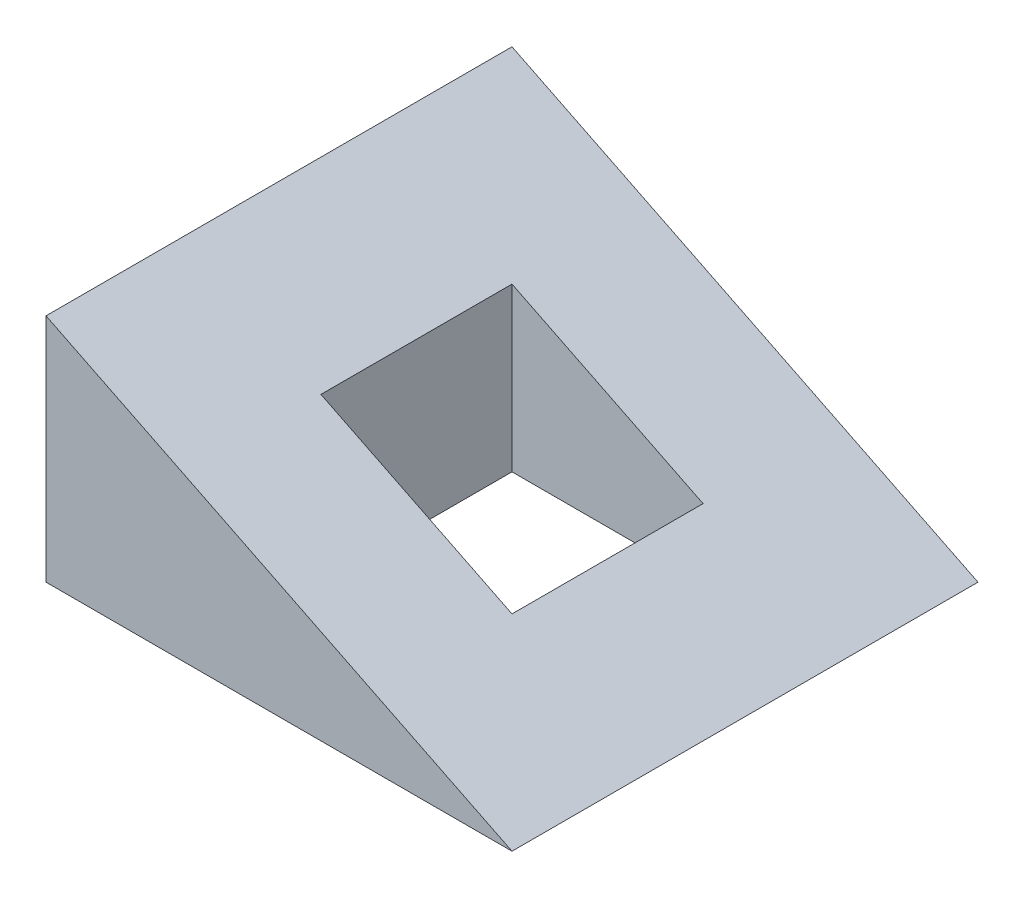
ISO-10303-21;
HEADER;
FILE_DESCRIPTION(('STEP AP214'),'2;1');
FILE_NAME('part.step','',(''),(''),'','','');
FILE_SCHEMA(('AUTOMOTIVE_DESIGN { 1 0 10303 214 1 1 1 1 }'));
ENDSEC;
DATA;
#1=APPLICATION_CONTEXT('core data for automotive mechanical design processes');
#2=APPLICATION_PROTOCOL_DEFINITION('international standard','automotive_design',2000,#1);
#3=PRODUCT_CONTEXT('',#1,'mechanical');
#4=PRODUCT('Part','Part','',(#3));
#5=PRODUCT_RELATED_PRODUCT_CATEGORY('part','',(#4));
#6=PRODUCT_DEFINITION_FORMATION('','',#4);
#7=PRODUCT_DEFINITION_CONTEXT('part definition',#1,'design');
#8=PRODUCT_DEFINITION('design','',#6,#7);
#9=PRODUCT_DEFINITION_SHAPE('','',#8);
#10=(LENGTH_UNIT() NAMED_UNIT(*) SI_UNIT(.MILLI.,.METRE.));
#11=(NAMED_UNIT(*) PLANE_ANGLE_UNIT() SI_UNIT($,.RADIAN.));
#12=(NAMED_UNIT(*) SI_UNIT($,.STERADIAN.) SOLID_ANGLE_UNIT());
#13=UNCERTAINTY_MEASURE_WITH_UNIT(LENGTH_MEASURE(1.E-05),#10,'distance_accuracy_value','');
#14=(GEOMETRIC_REPRESENTATION_CONTEXT(3) GLOBAL_UNCERTAINTY_ASSIGNED_CONTEXT((#13)) GLOBAL_UNIT_ASSIGNED_CONTEXT((#10,
#11,#12)) REPRESENTATION_CONTEXT('',''));
#15=CARTESIAN_POINT('',(0.,0.,0.));
#16=DIRECTION('',(0.,0.,1.));
#17=DIRECTION('',(1.,0.,0.));
#18=AXIS2_PLACEMENT_3D('',#15,#16,#17);
#19=CARTESIAN_POINT('',(0.,9.9,20.));
#20=DIRECTION('',(1.,0.,0.));
#21=DIRECTION('',(0.,0.,-1.));
#22=AXIS2_PLACEMENT_3D('',#19,#20,#21);
#23=PLANE('',#22);
#24=DIRECTION('',(0.,-1.,0.));
#25=VECTOR('',#24,1.);
#26=CARTESIAN_POINT('',(0.,9.9,0.));
#27=LINE('',#26,#25);
#28=CARTESIAN_POINT('',(0.,9.9,0.));
#29=VERTEX_POINT('',#28);
#30=CARTESIAN_POINT('',(0.,0.,0.));
#31=VERTEX_POINT('',#30);
#32=EDGE_CURVE('E122',#29,#31,#27,.T.);
#33=ORIENTED_EDGE('',*,*,#32,.T.);
#34=DIRECTION('',(0.,0.,-1.));
#35=VECTOR('',#34,1.);
#36=CARTESIAN_POINT('',(0.,0.,20.));
#37=LINE('',#36,#35);
#38=CARTESIAN_POINT('',(0.,0.,20.));
#39=VERTEX_POINT('',#38);
#40=EDGE_CURVE('E144',#39,#31,#37,.T.);
#41=ORIENTED_EDGE('',*,*,#40,.F.);
#42=DIRECTION('',(0.,-1.,0.));
#43=VECTOR('',#42,1.);
#44=CARTESIAN_POINT('',(0.,9.9,20.));
#45=LINE('',#44,#43);
#46=CARTESIAN_POINT('',(0.,9.9,20.));
#47=VERTEX_POINT('',#46);
#48=EDGE_CURVE('E125',#47,#39,#45,.T.);
#49=ORIENTED_EDGE('',*,*,#48,.F.);
#50=DIRECTION('',(0.,0.,-1.));
#51=VECTOR('',#50,1.);
#52=CARTESIAN_POINT('',(0.,9.9,20.));
#53=LINE('',#52,#51);
#54=EDGE_CURVE('E133',#47,#29,#53,.T.);
#55=ORIENTED_EDGE('',*,*,#54,.T.);
#56=EDGE_LOOP('',(#33,#41,#49,#55));
#57=FACE_BOUND('',#56,.T.);
#58=ADVANCED_FACE('F38',(#57),#23,.F.);
#59=CARTESIAN_POINT('',(0.,0.,20.));
#60=DIRECTION('',(0.,1.,0.));
#61=DIRECTION('',(0.,0.,1.));
#62=AXIS2_PLACEMENT_3D('',#59,#60,#61);
#63=PLANE('',#62);
#64=DIRECTION('',(-1.,0.,0.));
#65=VECTOR('',#64,1.);
#66=CARTESIAN_POINT('',(5.9,0.,14.1));
#67=LINE('',#66,#65);
#68=CARTESIAN_POINT('',(14.1,0.,14.1));
#69=VERTEX_POINT('',#68);
#70=CARTESIAN_POINT('',(5.9,0.,14.1));
#71=VERTEX_POINT('',#70);
#72=EDGE_CURVE('E108',#69,#71,#67,.T.);
#73=ORIENTED_EDGE('',*,*,#72,.F.);
#74=DIRECTION('',(0.,0.,1.));
#75=VECTOR('',#74,1.);
#76=CARTESIAN_POINT('',(14.1,0.,5.9));
#77=LINE('',#76,#75);
#78=CARTESIAN_POINT('',(14.1,0.,5.9));
#79=VERTEX_POINT('',#78);
#80=EDGE_CURVE('E52',#79,#69,#77,.T.);
#81=ORIENTED_EDGE('',*,*,#80,.F.);
#82=DIRECTION('',(1.,0.,0.));
#83=VECTOR('',#82,1.);
#84=CARTESIAN_POINT('',(5.9,0.,5.9));
#85=LINE('',#84,#83);
#86=CARTESIAN_POINT('',(5.9,0.,5.9));
#87=VERTEX_POINT('',#86);
#88=EDGE_CURVE('E115',#87,#79,#85,.T.);
#89=ORIENTED_EDGE('',*,*,#88,.F.);
#90=DIRECTION('',(0.,0.,-1.));
#91=VECTOR('',#90,1.);
#92=CARTESIAN_POINT('',(5.9,0.,5.9));
#93=LINE('',#92,#91);
#94=EDGE_CURVE('E99',#71,#87,#93,.T.);
#95=ORIENTED_EDGE('',*,*,#94,.F.);
#96=EDGE_LOOP('',(#73,#81,#89,#95));
#97=FACE_BOUND('',#96,.T.);
#98=DIRECTION('',(1.,0.,0.));
#99=VECTOR('',#98,1.);
#100=CARTESIAN_POINT('',(0.,0.,0.));
#101=LINE('',#100,#99);
#102=CARTESIAN_POINT('',(20.,0.,0.));
#103=VERTEX_POINT('',#102);
#104=EDGE_CURVE('E136',#31,#103,#101,.T.);
#105=ORIENTED_EDGE('',*,*,#104,.T.);
#106=DIRECTION('',(0.,0.,-1.));
#107=VECTOR('',#106,1.);
#108=CARTESIAN_POINT('',(20.,0.,20.));
#109=LINE('',#108,#107);
#110=CARTESIAN_POINT('',(20.,0.,20.));
#111=VERTEX_POINT('',#110);
#112=EDGE_CURVE('E141',#111,#103,#109,.T.);
#113=ORIENTED_EDGE('',*,*,#112,.F.);
#114=DIRECTION('',(1.,0.,0.));
#115=VECTOR('',#114,1.);
#116=CARTESIAN_POINT('',(0.,0.,20.));
#117=LINE('',#116,#115);
#118=EDGE_CURVE('E128',#39,#111,#117,.T.);
#119=ORIENTED_EDGE('',*,*,#118,.F.);
#120=ORIENTED_EDGE('',*,*,#40,.T.);
#121=EDGE_LOOP('',(#105,#113,#119,#120));
#122=FACE_BOUND('',#121,.T.);
#123=ADVANCED_FACE('F112',(#97,#122),#63,.F.);
#124=CARTESIAN_POINT('',(20.,0.,20.));
#125=DIRECTION('',(-0.443625153753289,-0.896212431824827,0.));
#126=DIRECTION('',(0.896212431824827,-0.443625153753289,0.));
#127=AXIS2_PLACEMENT_3D('',#124,#125,#126);
#128=PLANE('',#127);
#129=DIRECTION('',(0.896212431824827,-0.443625153753289,0.));
#130=VECTOR('',#129,1.);
#131=CARTESIAN_POINT('',(20.,0.,5.9));
#132=LINE('',#131,#130);
#133=CARTESIAN_POINT('',(5.9,6.9795,5.9));
#134=VERTEX_POINT('',#133);
#135=CARTESIAN_POINT('',(14.1,2.9205,5.9));
#136=VERTEX_POINT('',#135);
#137=EDGE_CURVE('E45',#134,#136,#132,.T.);
#138=ORIENTED_EDGE('',*,*,#137,.T.);
#139=DIRECTION('',(0.,0.,1.));
#140=VECTOR('',#139,1.);
#141=CARTESIAN_POINT('',(14.1,2.9205,20.));
#142=LINE('',#141,#140);
#143=CARTESIAN_POINT('',(14.1,2.9205,14.1));
#144=VERTEX_POINT('',#143);
#145=EDGE_CURVE('E11',#136,#144,#142,.T.);
#146=ORIENTED_EDGE('',*,*,#145,.T.);
#147=DIRECTION('',(-0.896212431824827,0.443625153753289,0.));
#148=VECTOR('',#147,1.);
#149=CARTESIAN_POINT('',(20.,0.,14.1));
#150=LINE('',#149,#148);
#151=CARTESIAN_POINT('',(5.9,6.9795,14.1));
#152=VERTEX_POINT('',#151);
#153=EDGE_CURVE('E147',#144,#152,#150,.T.);
#154=ORIENTED_EDGE('',*,*,#153,.T.);
#155=DIRECTION('',(0.,0.,-1.));
#156=VECTOR('',#155,1.);
#157=CARTESIAN_POINT('',(5.9,6.9795,20.));
#158=LINE('',#157,#156);
#159=EDGE_CURVE('E102',#152,#134,#158,.T.);
#160=ORIENTED_EDGE('',*,*,#159,.T.);
#161=EDGE_LOOP('',(#138,#146,#154,#160));
#162=FACE_BOUND('',#161,.T.);
#163=DIRECTION('',(-0.896212431824827,0.443625153753289,0.));
#164=VECTOR('',#163,1.);
#165=CARTESIAN_POINT('',(20.,0.,0.));
#166=LINE('',#165,#164);
#167=EDGE_CURVE('E129',#103,#29,#166,.T.);
#168=ORIENTED_EDGE('',*,*,#167,.T.);
#169=ORIENTED_EDGE('',*,*,#54,.F.);
#170=DIRECTION('',(-0.896212431824827,0.443625153753289,0.));
#171=VECTOR('',#170,1.);
#172=CARTESIAN_POINT('',(20.,0.,20.));
#173=LINE('',#172,#171);
#174=EDGE_CURVE('E131',#111,#47,#173,.T.);
#175=ORIENTED_EDGE('',*,*,#174,.F.);
#176=ORIENTED_EDGE('',*,*,#112,.T.);
#177=EDGE_LOOP('',(#168,#169,#175,#176));
#178=FACE_BOUND('',#177,.T.);
#179=ADVANCED_FACE('F151',(#162,#178),#128,.F.);
#180=CARTESIAN_POINT('',(0.,0.,20.));
#181=DIRECTION('',(0.,0.,1.));
#182=DIRECTION('',(1.,0.,0.));
#183=AXIS2_PLACEMENT_3D('',#180,#181,#182);
#184=PLANE('',#183);
#185=ORIENTED_EDGE('',*,*,#48,.T.);
#186=ORIENTED_EDGE('',*,*,#118,.T.);
#187=ORIENTED_EDGE('',*,*,#174,.T.);
#188=EDGE_LOOP('',(#185,#186,#187));
#189=FACE_BOUND('',#188,.T.);
#190=ADVANCED_FACE('F165',(#189),#184,.T.);
#191=CARTESIAN_POINT('',(0.,0.,0.));
#192=DIRECTION('',(0.,0.,1.));
#193=DIRECTION('',(1.,0.,0.));
#194=AXIS2_PLACEMENT_3D('',#191,#192,#193);
#195=PLANE('',#194);
#196=ORIENTED_EDGE('',*,*,#32,.F.);
#197=ORIENTED_EDGE('',*,*,#167,.F.);
#198=ORIENTED_EDGE('',*,*,#104,.F.);
#199=EDGE_LOOP('',(#196,#197,#198));
#200=FACE_BOUND('',#199,.T.);
#201=ADVANCED_FACE('F158',(#200),#195,.F.);
#202=CARTESIAN_POINT('',(14.1,20.,5.9));
#203=DIRECTION('',(1.,0.,0.));
#204=DIRECTION('',(0.,0.,-1.));
#205=AXIS2_PLACEMENT_3D('',#202,#203,#204);
#206=PLANE('',#205);
#207=DIRECTION('',(0.,-1.,0.));
#208=VECTOR('',#207,1.);
#209=CARTESIAN_POINT('',(14.1,20.,5.9));
#210=LINE('',#209,#208);
#211=EDGE_CURVE('E120',#136,#79,#210,.T.);
#212=ORIENTED_EDGE('',*,*,#211,.T.);
#213=ORIENTED_EDGE('',*,*,#80,.T.);
#214=DIRECTION('',(0.,-1.,0.));
#215=VECTOR('',#214,1.);
#216=CARTESIAN_POINT('',(14.1,20.,14.1));
#217=LINE('',#216,#215);
#218=EDGE_CURVE('E105',#144,#69,#217,.T.);
#219=ORIENTED_EDGE('',*,*,#218,.F.);
#220=ORIENTED_EDGE('',*,*,#145,.F.);
#221=EDGE_LOOP('',(#212,#213,#219,#220));
#222=FACE_BOUND('',#221,.T.);
#223=ADVANCED_FACE('F156',(#222),#206,.F.);
#224=CARTESIAN_POINT('',(5.9,20.,5.9));
#225=DIRECTION('',(0.,0.,-1.));
#226=DIRECTION('',(-1.,0.,0.));
#227=AXIS2_PLACEMENT_3D('',#224,#225,#226);
#228=PLANE('',#227);
#229=DIRECTION('',(0.,-1.,0.));
#230=VECTOR('',#229,1.);
#231=CARTESIAN_POINT('',(5.9,20.,5.9));
#232=LINE('',#231,#230);
#233=EDGE_CURVE('E104',#134,#87,#232,.T.);
#234=ORIENTED_EDGE('',*,*,#233,.T.);
#235=ORIENTED_EDGE('',*,*,#88,.T.);
#236=ORIENTED_EDGE('',*,*,#211,.F.);
#237=ORIENTED_EDGE('',*,*,#137,.F.);
#238=EDGE_LOOP('',(#234,#235,#236,#237));
#239=FACE_BOUND('',#238,.T.);
#240=ADVANCED_FACE('F155',(#239),#228,.F.);
#241=CARTESIAN_POINT('',(5.9,20.,5.9));
#242=DIRECTION('',(-1.,0.,0.));
#243=DIRECTION('',(0.,0.,1.));
#244=AXIS2_PLACEMENT_3D('',#241,#242,#243);
#245=PLANE('',#244);
#246=DIRECTION('',(0.,-1.,0.));
#247=VECTOR('',#246,1.);
#248=CARTESIAN_POINT('',(5.9,20.,14.1));
#249=LINE('',#248,#247);
#250=EDGE_CURVE('E60',#152,#71,#249,.T.);
#251=ORIENTED_EDGE('',*,*,#250,.T.);
#252=ORIENTED_EDGE('',*,*,#94,.T.);
#253=ORIENTED_EDGE('',*,*,#233,.F.);
#254=ORIENTED_EDGE('',*,*,#159,.F.);
#255=EDGE_LOOP('',(#251,#252,#253,#254));
#256=FACE_BOUND('',#255,.T.);
#257=ADVANCED_FACE('F96',(#256),#245,.F.);
#258=CARTESIAN_POINT('',(5.9,20.,14.1));
#259=DIRECTION('',(0.,0.,1.));
#260=DIRECTION('',(1.,0.,0.));
#261=AXIS2_PLACEMENT_3D('',#258,#259,#260);
#262=PLANE('',#261);
#263=ORIENTED_EDGE('',*,*,#218,.T.);
#264=ORIENTED_EDGE('',*,*,#72,.T.);
#265=ORIENTED_EDGE('',*,*,#250,.F.);
#266=ORIENTED_EDGE('',*,*,#153,.F.);
#267=EDGE_LOOP('',(#263,#264,#265,#266));
#268=FACE_BOUND('',#267,.T.);
#269=ADVANCED_FACE('F109',(#268),#262,.F.);
#270=CLOSED_SHELL('',(#58,#123,#179,#190,#201,#223,#240,#257,#269));
#271=MANIFOLD_SOLID_BREP('B2',#270);
#272=ADVANCED_BREP_SHAPE_REPRESENTATION('',(#18,#271),#14);
#273=SHAPE_DEFINITION_REPRESENTATION(#9,#272);
ENDSEC;
END-ISO-10303-21;
